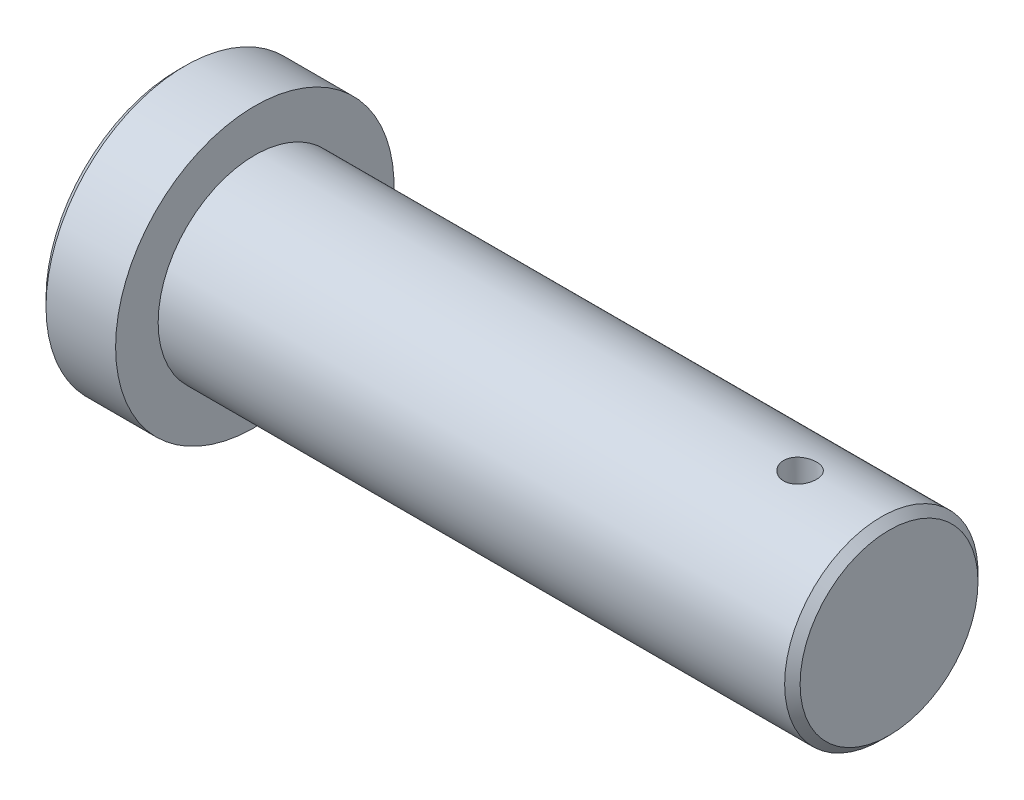
ISO-10303-21;
HEADER;
FILE_DESCRIPTION(('STEP AP214'),'2;1');
FILE_NAME('part.step','',(''),(''),'','','');
FILE_SCHEMA(('AUTOMOTIVE_DESIGN { 1 0 10303 214 1 1 1 1 }'));
ENDSEC;
DATA;
#1=APPLICATION_CONTEXT('core data for automotive mechanical design processes');
#2=APPLICATION_PROTOCOL_DEFINITION('international standard','automotive_design',2000,#1);
#3=PRODUCT_CONTEXT('',#1,'mechanical');
#4=PRODUCT('Part','Part','',(#3));
#5=PRODUCT_RELATED_PRODUCT_CATEGORY('part','',(#4));
#6=PRODUCT_DEFINITION_FORMATION('','',#4);
#7=PRODUCT_DEFINITION_CONTEXT('part definition',#1,'design');
#8=PRODUCT_DEFINITION('design','',#6,#7);
#9=PRODUCT_DEFINITION_SHAPE('','',#8);
#10=(LENGTH_UNIT() NAMED_UNIT(*) SI_UNIT(.MILLI.,.METRE.));
#11=(NAMED_UNIT(*) PLANE_ANGLE_UNIT() SI_UNIT($,.RADIAN.));
#12=(NAMED_UNIT(*) SI_UNIT($,.STERADIAN.) SOLID_ANGLE_UNIT());
#13=UNCERTAINTY_MEASURE_WITH_UNIT(LENGTH_MEASURE(1.E-05),#10,'distance_accuracy_value','');
#14=(GEOMETRIC_REPRESENTATION_CONTEXT(3) GLOBAL_UNCERTAINTY_ASSIGNED_CONTEXT((#13)) GLOBAL_UNIT_ASSIGNED_CONTEXT((#10,
#11,#12)) REPRESENTATION_CONTEXT('',''));
#15=CARTESIAN_POINT('',(0.,0.,0.));
#16=DIRECTION('',(0.,0.,1.));
#17=DIRECTION('',(1.,0.,0.));
#18=AXIS2_PLACEMENT_3D('',#15,#16,#17);
#19=CARTESIAN_POINT('',(0.,0.,0.));
#20=DIRECTION('',(-1.,0.,0.));
#21=DIRECTION('',(0.,0.,1.));
#22=AXIS2_PLACEMENT_3D('',#19,#20,#21);
#23=CYLINDRICAL_SURFACE('',#22,12.5);
#24=CARTESIAN_POINT('',(91.,0.,0.));
#25=DIRECTION('',(-1.,0.,0.));
#26=DIRECTION('',(0.,0.,1.));
#27=AXIS2_PLACEMENT_3D('',#24,#25,#26);
#28=CIRCLE('',#27,12.5);
#29=CARTESIAN_POINT('',(91.,0.,12.5));
#30=VERTEX_POINT('',#29);
#31=EDGE_CURVE('E52',#30,#30,#28,.T.);
#32=ORIENTED_EDGE('',*,*,#31,.T.);
#33=EDGE_LOOP('',(#32));
#34=FACE_BOUND('',#33,.T.);
#35=CARTESIAN_POINT('',(79.0528308083836,12.4025181743333,-1.55805742363095));
#36=CARTESIAN_POINT('',(78.9654316444651,12.412742450187,-1.47666343933552));
#37=CARTESIAN_POINT('',(78.8848637991568,12.4230829684496,-1.38785297968133));
#38=CARTESIAN_POINT('',(78.7396752868945,12.4428402505489,-1.19785049997812));
#39=CARTESIAN_POINT('',(78.675069195418,12.452256165392,-1.0966472886623));
#40=CARTESIAN_POINT('',(78.5636999190621,12.4691067619238,-0.884683032937936));
#41=CARTESIAN_POINT('',(78.5169376928174,12.4765413371616,-0.773921475413448));
#42=CARTESIAN_POINT('',(78.4426720797703,12.4885904916673,-0.546000028605867));
#43=CARTESIAN_POINT('',(78.4151636436803,12.4932058102422,-0.428841825531612));
#44=CARTESIAN_POINT('',(78.3803798221263,12.4990724020416,-0.192471937713145));
#45=CARTESIAN_POINT('',(78.3729381997344,12.5003513117508,-0.0732854078704812));
#46=CARTESIAN_POINT('',(78.3780413908664,12.4994817507914,0.164646477542037));
#47=CARTESIAN_POINT('',(78.3905860291237,12.4973333101783,0.283391836971521));
#48=CARTESIAN_POINT('',(78.4351124619854,12.4898766620153,0.516194533412014));
#49=CARTESIAN_POINT('',(78.466955707098,12.4845909830135,0.63027915615909));
#50=CARTESIAN_POINT('',(78.5490140128245,12.4714582459327,0.85147888264361));
#51=CARTESIAN_POINT('',(78.5992299680758,12.4636110631265,0.9585936466928));
#52=CARTESIAN_POINT('',(78.71706246759,12.4461398955507,1.16374186416678));
#53=CARTESIAN_POINT('',(78.7848119377049,12.4365025036226,1.26169780056985));
#54=CARTESIAN_POINT('',(78.9356389507785,12.4165496564993,1.44492340189085));
#55=CARTESIAN_POINT('',(79.0187176257682,12.406234151263,1.53019212904313));
#56=CARTESIAN_POINT('',(79.1988965886697,12.3859554374608,1.68653546135461));
#57=CARTESIAN_POINT('',(79.2961344252529,12.3759970412764,1.75745230254745));
#58=CARTESIAN_POINT('',(79.5012872415546,12.35768201071,1.88193233852185));
#59=CARTESIAN_POINT('',(79.6092019175118,12.3493253307783,1.93549602682392));
#60=CARTESIAN_POINT('',(79.8322056037266,12.3352136867271,2.0234853346944));
#61=CARTESIAN_POINT('',(79.9472622505725,12.3294478402554,2.05799114639938));
#62=CARTESIAN_POINT('',(80.1816525845412,12.3211446978114,2.10713640948715));
#63=CARTESIAN_POINT('',(80.300985838834,12.3186070760581,2.12177786552102));
#64=CARTESIAN_POINT('',(80.5387515692359,12.3170723466329,2.1306684202737));
#65=CARTESIAN_POINT('',(80.6571732315753,12.3180261189257,2.12520043146675));
#66=CARTESIAN_POINT('',(80.8913850921336,12.3232532804645,2.09467511115106));
#67=CARTESIAN_POINT('',(81.0071753283566,12.3275266217366,2.0696180627408));
#68=CARTESIAN_POINT('',(81.2325457854264,12.3388847676528,2.00078108729884));
#69=CARTESIAN_POINT('',(81.342142178126,12.3459618237273,1.95705273607624));
#70=CARTESIAN_POINT('',(81.5524861786767,12.3621315741416,1.85216249201316));
#71=CARTESIAN_POINT('',(81.6532330887943,12.3712244272172,1.79099922613571));
#72=CARTESIAN_POINT('',(81.8443966333709,12.3905458117049,1.65207135538639));
#73=CARTESIAN_POINT('',(81.9346664364313,12.4007872566114,1.57410649409439));
#74=CARTESIAN_POINT('',(82.1009402449747,12.4211727929542,1.40419827569741));
#75=CARTESIAN_POINT('',(82.1769433801506,12.4313168784155,1.31225406643149));
#76=CARTESIAN_POINT('',(82.3132188386249,12.4504768113989,1.115984654626));
#77=CARTESIAN_POINT('',(82.3733404496259,12.4594814546221,1.01155360631848));
#78=CARTESIAN_POINT('',(82.4751797170349,12.4752389844644,0.793914928399259));
#79=CARTESIAN_POINT('',(82.5168983226771,12.4819919872196,0.68070775181789));
#80=CARTESIAN_POINT('',(82.5804500456143,12.4924450290561,0.449556150356609));
#81=CARTESIAN_POINT('',(82.6024198650621,12.4961660386974,0.331650285366568));
#82=CARTESIAN_POINT('',(82.6262890322002,12.500214047161,0.0937702178108906));
#83=CARTESIAN_POINT('',(82.6281898333457,12.5005412917693,-0.0262038343404064));
#84=CARTESIAN_POINT('',(82.6119541799572,12.4977807963454,-0.26344129728471));
#85=CARTESIAN_POINT('',(82.5940335138072,12.494729833124,-0.38071998684638));
#86=CARTESIAN_POINT('',(82.5390456413406,12.4856091645647,-0.61057389596388));
#87=CARTESIAN_POINT('',(82.5019780854971,12.4795394041185,-0.723149029615615));
#88=CARTESIAN_POINT('',(82.4096649380528,12.4650267914561,-0.940767273587988));
#89=CARTESIAN_POINT('',(82.3543709767367,12.4565776335183,-1.04578942625974));
#90=CARTESIAN_POINT('',(82.2271979747596,12.4382355280419,-1.24512254443019));
#91=CARTESIAN_POINT('',(82.1553175634164,12.4283424612054,-1.33943262373581));
#92=CARTESIAN_POINT('',(81.9959848105041,12.4080691677716,-1.51585350055792));
#93=CARTESIAN_POINT('',(81.9083568571058,12.3976845361365,-1.59780526593778));
#94=CARTESIAN_POINT('',(81.7205226673451,12.3777036182523,-1.74586663895973));
#95=CARTESIAN_POINT('',(81.6203161854558,12.3681073473976,-1.8119759372912));
#96=CARTESIAN_POINT('',(81.4098628401426,12.3507774764171,-1.92657099200335));
#97=CARTESIAN_POINT('',(81.2995959033382,12.3430477176594,-1.975020506336));
#98=CARTESIAN_POINT('',(81.0723242350717,12.3303793416668,-2.05263354793034));
#99=CARTESIAN_POINT('',(80.9553203240791,12.3254403853401,-2.08179941829305));
#100=CARTESIAN_POINT('',(80.7194951818598,12.3189810698754,-2.11968735213539));
#101=CARTESIAN_POINT('',(80.6007163837449,12.3174177608713,-2.12866632391352));
#102=CARTESIAN_POINT('',(80.3633145076905,12.3177654067555,-2.12665391250122));
#103=CARTESIAN_POINT('',(80.2446914503033,12.3196767815077,-2.11566011589799));
#104=CARTESIAN_POINT('',(80.0120443265998,12.3267190671061,-2.07422912464658));
#105=CARTESIAN_POINT('',(79.8979898481637,12.331822610529,-2.04395716783456));
#106=CARTESIAN_POINT('',(79.6766554833017,12.3446411066283,-1.9650500061844));
#107=CARTESIAN_POINT('',(79.569370211405,12.352353951494,-1.91642961967654));
#108=CARTESIAN_POINT('',(79.3921179765807,12.367203475112,-1.81770137650004));
#109=CARTESIAN_POINT('',(79.3198901067037,12.3739345081677,-1.77153139994897));
#110=CARTESIAN_POINT('',(79.1815498825345,12.3879298619748,-1.67086208785518));
#111=CARTESIAN_POINT('',(79.1154376610142,12.3951941942982,-1.61636257154461));
#112=CARTESIAN_POINT('',(79.0528308083836,12.4025181743333,-1.55805742363095));
#113=B_SPLINE_CURVE_WITH_KNOTS('',3,(#35,#36,#37,#38,#39,#40,#41,#42,#43,#44,#45,#46,#47,#48,
#49,#50,#51,#52,#53,#54,#55,#56,#57,#58,#59,#60,#61,#62,#63,#64,#65,#66,#67,#68,#69,#70,#71,#72,
#73,#74,#75,#76,#77,#78,#79,#80,#81,#82,#83,#84,#85,#86,#87,#88,#89,#90,#91,#92,#93,#94,#95,#96,
#97,#98,#99,#100,#101,#102,#103,#104,#105,#106,#107,#108,#109,#110,#111,#112),.UNSPECIFIED.,.T.,
.F.,(4,2,2,2,2,2,2,2,2,2,2,2,2,2,2,2,2,2,2,2,2,2,2,2,2,2,2,2,2,2,2,2,2,2,2,2,2,2,4),(0.,
0.35929307870521,0.718913043275654,1.07855232516888,1.43809725664013,1.79465437150273,
2.15120835960432,2.50523239025093,2.85927366197448,3.21608191857583,3.57291653530658,
3.93348283952685,4.29403888840688,4.65306599299727,5.01205686295563,5.36601666514855,
5.71997135205584,6.07295457031318,6.42596559444032,6.78344307521784,7.14094235605181,
7.50172136101493,7.86248175467977,8.2207252744398,8.57894284900919,8.93329870095928,
9.28766102191389,9.64297143376296,9.9983112185106,10.3578919782365,10.7174797578972,
11.0778013961018,11.4380792445934,11.7937454249294,12.1494545851063,12.5021551734451,
12.8545715255938,13.1119392118809,13.3693124843604),.UNSPECIFIED.);
#114=CARTESIAN_POINT('',(79.0528308083836,12.4025181743333,-1.55805742363095));
#115=VERTEX_POINT('',#114);
#116=EDGE_CURVE('E77',#115,#115,#113,.T.);
#117=ORIENTED_EDGE('',*,*,#116,.F.);
#118=EDGE_LOOP('',(#117));
#119=FACE_BOUND('',#118,.T.);
#120=CARTESIAN_POINT('',(10.,0.,0.));
#121=DIRECTION('',(-1.,0.,0.));
#122=DIRECTION('',(0.,0.,1.));
#123=AXIS2_PLACEMENT_3D('',#120,#121,#122);
#124=CIRCLE('',#123,12.5);
#125=CARTESIAN_POINT('',(10.,0.,12.5));
#126=VERTEX_POINT('',#125);
#127=EDGE_CURVE('E113',#126,#126,#124,.T.);
#128=ORIENTED_EDGE('',*,*,#127,.F.);
#129=EDGE_LOOP('',(#128));
#130=FACE_BOUND('',#129,.T.);
#131=CARTESIAN_POINT('',(78.7860449706975,-12.3671984697056,-1.81725122394016));
#132=CARTESIAN_POINT('',(78.8879997012728,-12.35311250337,-1.91311423327469));
#133=CARTESIAN_POINT('',(78.9980796011775,-12.3391395359076,-2.00044748775408));
#134=CARTESIAN_POINT('',(79.2315108698176,-12.3129865973986,-2.15559356335946));
#135=CARTESIAN_POINT('',(79.354872040585,-12.3008079665528,-2.22339182944304));
#136=CARTESIAN_POINT('',(79.6115034096832,-12.2796420236739,-2.3374719364031));
#137=CARTESIAN_POINT('',(79.7447772567396,-12.2706558938592,-2.38374580851661));
#138=CARTESIAN_POINT('',(80.0173810486008,-12.2569420759099,-2.45329231916592));
#139=CARTESIAN_POINT('',(80.1567093858718,-12.2522132645651,-2.47657102468432));
#140=CARTESIAN_POINT('',(80.4356001347162,-12.2476067157756,-2.49925261662713));
#141=CARTESIAN_POINT('',(80.5751373487256,-12.2476684434507,-2.4989534404346));
#142=CARTESIAN_POINT('',(80.8521476474875,-12.2524844822792,-2.47523058174184));
#143=CARTESIAN_POINT('',(80.9896207330545,-12.2572387915808,-2.45180690836744));
#144=CARTESIAN_POINT('',(81.2577183709307,-12.2708388457779,-2.3827983145129));
#145=CARTESIAN_POINT('',(81.388381164716,-12.2796581766663,-2.33735636981279));
#146=CARTESIAN_POINT('',(81.6402545697586,-12.3003808270567,-2.22572182267685));
#147=CARTESIAN_POINT('',(81.7614643378587,-12.3122844212495,-2.15952737187041));
#148=CARTESIAN_POINT('',(81.9928768510373,-12.3380465097932,-2.00714823663717));
#149=CARTESIAN_POINT('',(82.10289750971,-12.3519305138714,-1.92069135327946));
#150=CARTESIAN_POINT('',(82.3069879877342,-12.3799823923735,-1.73067606203783));
#151=CARTESIAN_POINT('',(82.4010564607565,-12.3941502906446,-1.62711621215579));
#152=CARTESIAN_POINT('',(82.5716992332503,-12.4213781020645,-1.40431114818308));
#153=CARTESIAN_POINT('',(82.6480495890701,-12.4344226449224,-1.28489230986869));
#154=CARTESIAN_POINT('',(82.7795414789646,-12.4577394897178,-1.03464735816134));
#155=CARTESIAN_POINT('',(82.8346845108129,-12.4680119874164,-0.903822051154413));
#156=CARTESIAN_POINT('',(82.9216121599737,-12.484532489804,-0.635829266389828));
#157=CARTESIAN_POINT('',(82.9536244815756,-12.4908196494443,-0.498738145763256));
#158=CARTESIAN_POINT('',(82.9941449637236,-12.4988177399689,-0.221000105259328));
#159=CARTESIAN_POINT('',(83.0026559724044,-12.5005292253804,-0.0803536183434527));
#160=CARTESIAN_POINT('',(82.9959592899832,-12.4991946883572,0.197869520106965));
#161=CARTESIAN_POINT('',(82.9811651473971,-12.4962316143394,0.335456735214052));
#162=CARTESIAN_POINT('',(82.9291029369371,-12.4860299597156,0.606141186887343));
#163=CARTESIAN_POINT('',(82.8918347542054,-12.4787913572588,0.739238400502901));
#164=CARTESIAN_POINT('',(82.7959350761913,-12.4608205762176,0.997355001534084));
#165=CARTESIAN_POINT('',(82.7372867133989,-12.4500856399779,1.12236791905099));
#166=CARTESIAN_POINT('',(82.600334885954,-12.4262787056329,1.36087531370868));
#167=CARTESIAN_POINT('',(82.5220292399274,-12.4132064482009,1.47436851053866));
#168=CARTESIAN_POINT('',(82.3463423868302,-12.3858747061431,1.6887910201806));
#169=CARTESIAN_POINT('',(82.2486446177736,-12.3715981498225,1.78945887138318));
#170=CARTESIAN_POINT('',(82.0377546185708,-12.3436424037949,1.97310466793955));
#171=CARTESIAN_POINT('',(81.9245613508294,-12.3299632541719,2.05608142772668));
#172=CARTESIAN_POINT('',(81.6846229096309,-12.3046186268373,2.20271844965557));
#173=CARTESIAN_POINT('',(81.5577630532204,-12.2929727510043,2.2661947286865));
#174=CARTESIAN_POINT('',(81.2949122263149,-12.273212049578,2.37089103434294));
#175=CARTESIAN_POINT('',(81.1589221665837,-12.2650968723897,2.41211327717381));
#176=CARTESIAN_POINT('',(80.8835016500518,-12.2534432738046,2.47063072586209));
#177=CARTESIAN_POINT('',(80.74413669841,-12.2498481136973,2.488222752262));
#178=CARTESIAN_POINT('',(80.4643917134783,-12.2474747783195,2.49988021277291));
#179=CARTESIAN_POINT('',(80.3240117701763,-12.248696181121,2.49394770761804));
#180=CARTESIAN_POINT('',(80.0482182949919,-12.255759909916,2.45899404853826));
#181=CARTESIAN_POINT('',(79.912763290917,-12.2615395917001,2.43028586812481));
#182=CARTESIAN_POINT('',(79.6486270927639,-12.2769765070019,2.35105575370405));
#183=CARTESIAN_POINT('',(79.5199462606038,-12.286633947456,2.30053265553366));
#184=CARTESIAN_POINT('',(79.2718807940363,-12.3088264196076,2.17867813146721));
#185=CARTESIAN_POINT('',(79.1525755827776,-12.3213830876775,2.10718909886691));
#186=CARTESIAN_POINT('',(78.9275349207448,-12.3479365649736,1.94554675248591));
#187=CARTESIAN_POINT('',(78.8218009735568,-12.3619335334643,1.85539137351195));
#188=CARTESIAN_POINT('',(78.6250901346829,-12.3900717386617,1.65719128809959));
#189=CARTESIAN_POINT('',(78.5343851822002,-12.4042115510039,1.54887622912484));
#190=CARTESIAN_POINT('',(78.3724326698494,-12.4308217484233,1.31837350220311));
#191=CARTESIAN_POINT('',(78.3011850045257,-12.4432921425484,1.19618590944817));
#192=CARTESIAN_POINT('',(78.1803338656651,-12.4651482704913,0.941475493188683));
#193=CARTESIAN_POINT('',(78.1307009921723,-12.4745381899834,0.808966999159746));
#194=CARTESIAN_POINT('',(78.0545067842063,-12.4891887918087,0.537262991823468));
#195=CARTESIAN_POINT('',(78.0279419138168,-12.494450106972,0.398068506813242));
#196=CARTESIAN_POINT('',(77.9990146259776,-12.5001886261529,0.119658321078453));
#197=CARTESIAN_POINT('',(77.996220425128,-12.500751177626,-0.0195108652543747));
#198=CARTESIAN_POINT('',(78.0137954691386,-12.497253556051,-0.296336146843579));
#199=CARTESIAN_POINT('',(78.0341669986221,-12.4931929270609,-0.433992091510937));
#200=CARTESIAN_POINT('',(78.0971695174596,-12.4809489492581,-0.702774513547669));
#201=CARTESIAN_POINT('',(78.1396275906426,-12.4727976437124,-0.83394316682261));
#202=CARTESIAN_POINT('',(78.2454020999986,-12.4532738277777,-1.08724423016092));
#203=CARTESIAN_POINT('',(78.3087051798896,-12.4419033806819,-1.20938236525697));
#204=CARTESIAN_POINT('',(78.4381152207093,-12.4199146333885,-1.41562368274851));
#205=CARTESIAN_POINT('',(78.5004749900241,-12.4096904189675,-1.50214859884364));
#206=CARTESIAN_POINT('',(78.6356714797484,-12.3886885224349,-1.66651072091893));
#207=CARTESIAN_POINT('',(78.7085085999761,-12.3779108192122,-1.74434759516009));
#208=CARTESIAN_POINT('',(78.7860449706975,-12.3671984697056,-1.81725122394016));
#209=B_SPLINE_CURVE_WITH_KNOTS('',3,(#131,#132,#133,#134,#135,#136,#137,#138,#139,#140,#141,
#142,#143,#144,#145,#146,#147,#148,#149,#150,#151,#152,#153,#154,#155,#156,#157,#158,#159,#160,
#161,#162,#163,#164,#165,#166,#167,#168,#169,#170,#171,#172,#173,#174,#175,#176,#177,#178,#179,
#180,#181,#182,#183,#184,#185,#186,#187,#188,#189,#190,#191,#192,#193,#194,#195,#196,#197,#198,
#199,#200,#201,#202,#203,#204,#205,#206,#207,#208),.UNSPECIFIED.,.T.,.F.,(4,2,2,2,2,2,2,2,2,2,2,
2,2,2,2,2,2,2,2,2,2,2,2,2,2,2,2,2,2,2,2,2,2,2,2,2,2,2,4),(0.,0.421575091230302,
0.843463480294897,1.26550793684356,1.68744101255891,2.10404327737513,2.52064537778401,
2.93457780522732,3.34854711101185,3.76843331156118,4.18835493196055,4.6133255541288,
5.03826615710751,5.45896433352289,5.87961152309877,6.29287802942388,6.70614664784115,
7.11974201523266,7.53338329972138,7.95443383113471,8.37551257034305,8.8004500433857,
9.22534519051037,9.64485167324888,10.064321408296,10.4781247736214,10.8919502244829,
11.3089699431363,11.7260358243835,12.1499755595817,12.5739129970475,12.997271989482,
13.420566077019,13.8361544249366,14.25178376207,14.6642070362504,15.0763665658443,
15.3969613507469,15.7175683728646),.UNSPECIFIED.);
#210=CARTESIAN_POINT('',(78.7860449706975,-12.3671984697056,-1.81725122394016));
#211=VERTEX_POINT('',#210);
#212=EDGE_CURVE('E68',#211,#211,#209,.T.);
#213=ORIENTED_EDGE('',*,*,#212,.F.);
#214=EDGE_LOOP('',(#213));
#215=FACE_BOUND('',#214,.T.);
#216=ADVANCED_FACE('F43',(#34,#119,#130,#215),#23,.T.);
#217=CARTESIAN_POINT('',(0.,0.,0.));
#218=DIRECTION('',(1.,0.,0.));
#219=DIRECTION('',(0.,0.,-1.));
#220=AXIS2_PLACEMENT_3D('',#217,#218,#219);
#221=PLANE('',#220);
#222=CARTESIAN_POINT('',(0.,0.,0.));
#223=DIRECTION('',(1.,0.,0.));
#224=DIRECTION('',(0.,0.,-1.));
#225=AXIS2_PLACEMENT_3D('',#222,#223,#224);
#226=CIRCLE('',#225,17.);
#227=CARTESIAN_POINT('',(0.,0.,-17.));
#228=VERTEX_POINT('',#227);
#229=EDGE_CURVE('E62',#228,#228,#226,.F.);
#230=ORIENTED_EDGE('',*,*,#229,.T.);
#231=EDGE_LOOP('',(#230));
#232=FACE_BOUND('',#231,.T.);
#233=ADVANCED_FACE('F100',(#232),#221,.F.);
#234=CARTESIAN_POINT('',(0.,0.,0.));
#235=DIRECTION('',(-1.,0.,0.));
#236=DIRECTION('',(0.,0.,1.));
#237=AXIS2_PLACEMENT_3D('',#234,#235,#236);
#238=CYLINDRICAL_SURFACE('',#237,18.);
#239=CARTESIAN_POINT('',(1.,0.,0.));
#240=DIRECTION('',(1.,0.,0.));
#241=DIRECTION('',(0.,0.,-1.));
#242=AXIS2_PLACEMENT_3D('',#239,#240,#241);
#243=CIRCLE('',#242,18.);
#244=CARTESIAN_POINT('',(1.,0.,-18.));
#245=VERTEX_POINT('',#244);
#246=EDGE_CURVE('E57',#245,#245,#243,.T.);
#247=ORIENTED_EDGE('',*,*,#246,.T.);
#248=EDGE_LOOP('',(#247));
#249=FACE_BOUND('',#248,.T.);
#250=CARTESIAN_POINT('',(10.,0.,0.));
#251=DIRECTION('',(-1.,0.,0.));
#252=DIRECTION('',(0.,0.,1.));
#253=AXIS2_PLACEMENT_3D('',#250,#251,#252);
#254=CIRCLE('',#253,18.);
#255=CARTESIAN_POINT('',(10.,0.,18.));
#256=VERTEX_POINT('',#255);
#257=EDGE_CURVE('E118',#256,#256,#254,.T.);
#258=ORIENTED_EDGE('',*,*,#257,.T.);
#259=EDGE_LOOP('',(#258));
#260=FACE_BOUND('',#259,.T.);
#261=ADVANCED_FACE('F97',(#249,#260),#238,.T.);
#262=CARTESIAN_POINT('',(10.,18.,0.));
#263=DIRECTION('',(-1.,0.,0.));
#264=DIRECTION('',(0.,0.,1.));
#265=AXIS2_PLACEMENT_3D('',#262,#263,#264);
#266=PLANE('',#265);
#267=ORIENTED_EDGE('',*,*,#257,.F.);
#268=EDGE_LOOP('',(#267));
#269=FACE_BOUND('',#268,.T.);
#270=ORIENTED_EDGE('',*,*,#127,.T.);
#271=EDGE_LOOP('',(#270));
#272=FACE_BOUND('',#271,.T.);
#273=ADVANCED_FACE('F93',(#269,#272),#266,.F.);
#274=CARTESIAN_POINT('',(92.0000000000032,12.5,0.));
#275=DIRECTION('',(-1.,0.,0.));
#276=DIRECTION('',(0.,0.,1.));
#277=AXIS2_PLACEMENT_3D('',#274,#275,#276);
#278=PLANE('',#277);
#279=CARTESIAN_POINT('',(92.0000000000032,0.,0.));
#280=DIRECTION('',(-1.,0.,0.));
#281=DIRECTION('',(0.,0.,1.));
#282=AXIS2_PLACEMENT_3D('',#279,#280,#281);
#283=CIRCLE('',#282,11.4999999999968);
#284=CARTESIAN_POINT('',(92.0000000000032,0.,11.4999999999968));
#285=VERTEX_POINT('',#284);
#286=EDGE_CURVE('E10',#285,#285,#283,.F.);
#287=ORIENTED_EDGE('',*,*,#286,.T.);
#288=EDGE_LOOP('',(#287));
#289=FACE_BOUND('',#288,.T.);
#290=ADVANCED_FACE('F89',(#289),#278,.F.);
#291=CARTESIAN_POINT('',(80.5,-12.5,0.));
#292=DIRECTION('',(0.,-1.,0.));
#293=DIRECTION('',(0.,0.,-1.));
#294=AXIS2_PLACEMENT_3D('',#291,#292,#293);
#295=CONICAL_SURFACE('',#294,2.5,0.0149988751518506);
#296=ORIENTED_EDGE('',*,*,#116,.T.);
#297=EDGE_LOOP('',(#296));
#298=FACE_BOUND('',#297,.T.);
#299=ORIENTED_EDGE('',*,*,#212,.T.);
#300=EDGE_LOOP('',(#299));
#301=FACE_BOUND('',#300,.T.);
#302=ADVANCED_FACE('F85',(#298,#301),#295,.F.);
#303=CARTESIAN_POINT('',(0.,0.,0.));
#304=DIRECTION('',(1.,0.,0.));
#305=DIRECTION('',(0.,0.,-1.));
#306=AXIS2_PLACEMENT_3D('',#303,#304,#305);
#307=CONICAL_SURFACE('',#306,17.,0.785398163397445);
#308=ORIENTED_EDGE('',*,*,#246,.F.);
#309=EDGE_LOOP('',(#308));
#310=FACE_BOUND('',#309,.T.);
#311=ORIENTED_EDGE('',*,*,#229,.F.);
#312=EDGE_LOOP('',(#311));
#313=FACE_BOUND('',#312,.T.);
#314=ADVANCED_FACE('F88',(#310,#313),#307,.T.);
#315=CARTESIAN_POINT('',(91.,0.,0.));
#316=DIRECTION('',(-1.,0.,0.));
#317=DIRECTION('',(0.,0.,1.));
#318=AXIS2_PLACEMENT_3D('',#315,#316,#317);
#319=CONICAL_SURFACE('',#318,12.5,0.785398163397443);
#320=ORIENTED_EDGE('',*,*,#286,.F.);
#321=EDGE_LOOP('',(#320));
#322=FACE_BOUND('',#321,.T.);
#323=ORIENTED_EDGE('',*,*,#31,.F.);
#324=EDGE_LOOP('',(#323));
#325=FACE_BOUND('',#324,.T.);
#326=ADVANCED_FACE('F46',(#322,#325),#319,.T.);
#327=CLOSED_SHELL('',(#216,#233,#261,#273,#290,#302,#314,#326));
#328=MANIFOLD_SOLID_BREP('B2',#327);
#329=ADVANCED_BREP_SHAPE_REPRESENTATION('',(#18,#328),#14);
#330=SHAPE_DEFINITION_REPRESENTATION(#9,#329);
ENDSEC;
END-ISO-10303-21;
